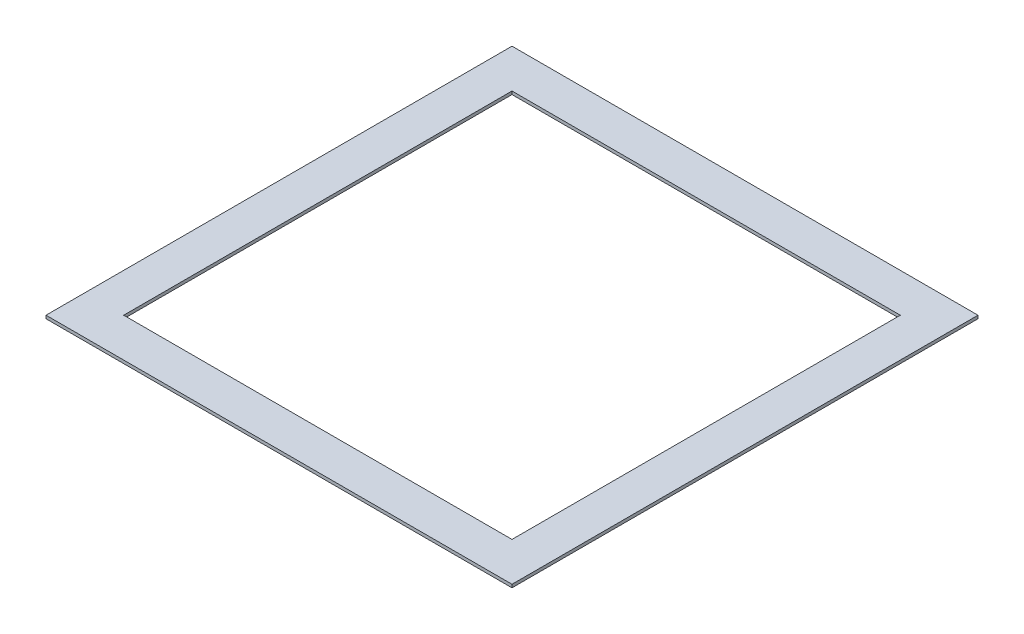
ISO-10303-21;
HEADER;
FILE_DESCRIPTION(('STEP AP214'),'2;1');
FILE_NAME('part.step','',(''),(''),'','','');
FILE_SCHEMA(('AUTOMOTIVE_DESIGN { 1 0 10303 214 1 1 1 1 }'));
ENDSEC;
DATA;
#1=APPLICATION_CONTEXT('core data for automotive mechanical design processes');
#2=APPLICATION_PROTOCOL_DEFINITION('international standard','automotive_design',2000,#1);
#3=PRODUCT_CONTEXT('',#1,'mechanical');
#4=PRODUCT('Part','Part','',(#3));
#5=PRODUCT_RELATED_PRODUCT_CATEGORY('part','',(#4));
#6=PRODUCT_DEFINITION_FORMATION('','',#4);
#7=PRODUCT_DEFINITION_CONTEXT('part definition',#1,'design');
#8=PRODUCT_DEFINITION('design','',#6,#7);
#9=PRODUCT_DEFINITION_SHAPE('','',#8);
#10=(LENGTH_UNIT() NAMED_UNIT(*) SI_UNIT(.MILLI.,.METRE.));
#11=(NAMED_UNIT(*) PLANE_ANGLE_UNIT() SI_UNIT($,.RADIAN.));
#12=(NAMED_UNIT(*) SI_UNIT($,.STERADIAN.) SOLID_ANGLE_UNIT());
#13=UNCERTAINTY_MEASURE_WITH_UNIT(LENGTH_MEASURE(1.E-05),#10,'distance_accuracy_value','');
#14=(GEOMETRIC_REPRESENTATION_CONTEXT(3) GLOBAL_UNCERTAINTY_ASSIGNED_CONTEXT((#13)) GLOBAL_UNIT_ASSIGNED_CONTEXT((#10,
#11,#12)) REPRESENTATION_CONTEXT('',''));
#15=CARTESIAN_POINT('',(0.,0.,0.));
#16=DIRECTION('',(0.,0.,1.));
#17=DIRECTION('',(1.,0.,0.));
#18=AXIS2_PLACEMENT_3D('',#15,#16,#17);
#19=CARTESIAN_POINT('',(600.,-8.,600.));
#20=DIRECTION('',(1.,0.,0.));
#21=DIRECTION('',(0.,0.,-1.));
#22=AXIS2_PLACEMENT_3D('',#19,#20,#21);
#23=PLANE('',#22);
#24=DIRECTION('',(0.,0.,-1.));
#25=VECTOR('',#24,1.);
#26=CARTESIAN_POINT('',(600.,0.,600.));
#27=LINE('',#26,#25);
#28=CARTESIAN_POINT('',(600.,0.,600.));
#29=VERTEX_POINT('',#28);
#30=CARTESIAN_POINT('',(600.,0.,-600.));
#31=VERTEX_POINT('',#30);
#32=EDGE_CURVE('E129',#29,#31,#27,.T.);
#33=ORIENTED_EDGE('',*,*,#32,.F.);
#34=DIRECTION('',(0.,1.,0.));
#35=VECTOR('',#34,1.);
#36=CARTESIAN_POINT('',(600.,-8.,600.));
#37=LINE('',#36,#35);
#38=CARTESIAN_POINT('',(600.,-8.,600.));
#39=VERTEX_POINT('',#38);
#40=EDGE_CURVE('E11',#39,#29,#37,.T.);
#41=ORIENTED_EDGE('',*,*,#40,.F.);
#42=DIRECTION('',(0.,0.,-1.));
#43=VECTOR('',#42,1.);
#44=CARTESIAN_POINT('',(600.,-8.,600.));
#45=LINE('',#44,#43);
#46=CARTESIAN_POINT('',(600.,-8.,-600.));
#47=VERTEX_POINT('',#46);
#48=EDGE_CURVE('E133',#39,#47,#45,.T.);
#49=ORIENTED_EDGE('',*,*,#48,.T.);
#50=DIRECTION('',(0.,1.,0.));
#51=VECTOR('',#50,1.);
#52=CARTESIAN_POINT('',(600.,-8.,-600.));
#53=LINE('',#52,#51);
#54=EDGE_CURVE('E34',#47,#31,#53,.T.);
#55=ORIENTED_EDGE('',*,*,#54,.T.);
#56=EDGE_LOOP('',(#33,#41,#49,#55));
#57=FACE_BOUND('',#56,.T.);
#58=ADVANCED_FACE('F31',(#57),#23,.T.);
#59=CARTESIAN_POINT('',(-599.999999999999,-8.,600.));
#60=DIRECTION('',(0.,0.,1.));
#61=DIRECTION('',(1.,0.,0.));
#62=AXIS2_PLACEMENT_3D('',#59,#60,#61);
#63=PLANE('',#62);
#64=DIRECTION('',(1.,0.,0.));
#65=VECTOR('',#64,1.);
#66=CARTESIAN_POINT('',(-599.999999999999,0.,600.));
#67=LINE('',#66,#65);
#68=CARTESIAN_POINT('',(-599.999999999999,0.,600.));
#69=VERTEX_POINT('',#68);
#70=EDGE_CURVE('E137',#69,#29,#67,.T.);
#71=ORIENTED_EDGE('',*,*,#70,.F.);
#72=DIRECTION('',(0.,1.,0.));
#73=VECTOR('',#72,1.);
#74=CARTESIAN_POINT('',(-599.999999999999,-8.,600.));
#75=LINE('',#74,#73);
#76=CARTESIAN_POINT('',(-599.999999999999,-8.,600.));
#77=VERTEX_POINT('',#76);
#78=EDGE_CURVE('E39',#77,#69,#75,.T.);
#79=ORIENTED_EDGE('',*,*,#78,.F.);
#80=DIRECTION('',(1.,0.,0.));
#81=VECTOR('',#80,1.);
#82=CARTESIAN_POINT('',(-599.999999999999,-8.,600.));
#83=LINE('',#82,#81);
#84=EDGE_CURVE('E143',#77,#39,#83,.T.);
#85=ORIENTED_EDGE('',*,*,#84,.T.);
#86=ORIENTED_EDGE('',*,*,#40,.T.);
#87=EDGE_LOOP('',(#71,#79,#85,#86));
#88=FACE_BOUND('',#87,.T.);
#89=ADVANCED_FACE('F169',(#88),#63,.T.);
#90=CARTESIAN_POINT('',(-599.999999999999,-8.,600.));
#91=DIRECTION('',(-1.,0.,0.));
#92=DIRECTION('',(0.,0.,1.));
#93=AXIS2_PLACEMENT_3D('',#90,#91,#92);
#94=PLANE('',#93);
#95=DIRECTION('',(0.,0.,1.));
#96=VECTOR('',#95,1.);
#97=CARTESIAN_POINT('',(-599.999999999999,0.,600.));
#98=LINE('',#97,#96);
#99=CARTESIAN_POINT('',(-599.999999999999,0.,-600.));
#100=VERTEX_POINT('',#99);
#101=EDGE_CURVE('E151',#100,#69,#98,.T.);
#102=ORIENTED_EDGE('',*,*,#101,.F.);
#103=DIRECTION('',(0.,1.,0.));
#104=VECTOR('',#103,1.);
#105=CARTESIAN_POINT('',(-599.999999999999,-8.,-600.));
#106=LINE('',#105,#104);
#107=CARTESIAN_POINT('',(-599.999999999999,-8.,-600.));
#108=VERTEX_POINT('',#107);
#109=EDGE_CURVE('E156',#108,#100,#106,.T.);
#110=ORIENTED_EDGE('',*,*,#109,.F.);
#111=DIRECTION('',(0.,0.,1.));
#112=VECTOR('',#111,1.);
#113=CARTESIAN_POINT('',(-599.999999999999,-8.,600.));
#114=LINE('',#113,#112);
#115=EDGE_CURVE('E140',#108,#77,#114,.T.);
#116=ORIENTED_EDGE('',*,*,#115,.T.);
#117=ORIENTED_EDGE('',*,*,#78,.T.);
#118=EDGE_LOOP('',(#102,#110,#116,#117));
#119=FACE_BOUND('',#118,.T.);
#120=ADVANCED_FACE('F173',(#119),#94,.T.);
#121=CARTESIAN_POINT('',(-599.999999999999,-8.,-600.));
#122=DIRECTION('',(0.,0.,-1.));
#123=DIRECTION('',(-1.,0.,0.));
#124=AXIS2_PLACEMENT_3D('',#121,#122,#123);
#125=PLANE('',#124);
#126=DIRECTION('',(-1.,0.,0.));
#127=VECTOR('',#126,1.);
#128=CARTESIAN_POINT('',(-599.999999999999,0.,-600.));
#129=LINE('',#128,#127);
#130=EDGE_CURVE('E148',#31,#100,#129,.T.);
#131=ORIENTED_EDGE('',*,*,#130,.F.);
#132=ORIENTED_EDGE('',*,*,#54,.F.);
#133=DIRECTION('',(-1.,0.,0.));
#134=VECTOR('',#133,1.);
#135=CARTESIAN_POINT('',(-599.999999999999,-8.,-600.));
#136=LINE('',#135,#134);
#137=EDGE_CURVE('E136',#47,#108,#136,.T.);
#138=ORIENTED_EDGE('',*,*,#137,.T.);
#139=ORIENTED_EDGE('',*,*,#109,.T.);
#140=EDGE_LOOP('',(#131,#132,#138,#139));
#141=FACE_BOUND('',#140,.T.);
#142=ADVANCED_FACE('F164',(#141),#125,.T.);
#143=CARTESIAN_POINT('',(600.,-8.,-600.));
#144=DIRECTION('',(0.,-1.,0.));
#145=DIRECTION('',(0.,0.,-1.));
#146=AXIS2_PLACEMENT_3D('',#143,#144,#145);
#147=PLANE('',#146);
#148=DIRECTION('',(0.,0.,1.));
#149=VECTOR('',#148,1.);
#150=CARTESIAN_POINT('',(-500.,-8.,-500.));
#151=LINE('',#150,#149);
#152=CARTESIAN_POINT('',(-500.,-8.,-500.));
#153=VERTEX_POINT('',#152);
#154=CARTESIAN_POINT('',(-500.,-8.,500.));
#155=VERTEX_POINT('',#154);
#156=EDGE_CURVE('E98',#153,#155,#151,.T.);
#157=ORIENTED_EDGE('',*,*,#156,.T.);
#158=DIRECTION('',(1.,0.,0.));
#159=VECTOR('',#158,1.);
#160=CARTESIAN_POINT('',(500.,-8.,500.000000000001));
#161=LINE('',#160,#159);
#162=CARTESIAN_POINT('',(500.,-8.,500.));
#163=VERTEX_POINT('',#162);
#164=EDGE_CURVE('E107',#155,#163,#161,.T.);
#165=ORIENTED_EDGE('',*,*,#164,.T.);
#166=DIRECTION('',(0.,0.,-1.));
#167=VECTOR('',#166,1.);
#168=CARTESIAN_POINT('',(500.000000000001,-8.,-500.));
#169=LINE('',#168,#167);
#170=CARTESIAN_POINT('',(500.000000000001,-8.,-500.));
#171=VERTEX_POINT('',#170);
#172=EDGE_CURVE('E47',#163,#171,#169,.T.);
#173=ORIENTED_EDGE('',*,*,#172,.T.);
#174=DIRECTION('',(-1.,0.,0.));
#175=VECTOR('',#174,1.);
#176=CARTESIAN_POINT('',(500.000000000001,-8.,-500.));
#177=LINE('',#176,#175);
#178=EDGE_CURVE('E104',#171,#153,#177,.T.);
#179=ORIENTED_EDGE('',*,*,#178,.T.);
#180=EDGE_LOOP('',(#157,#165,#173,#179));
#181=FACE_BOUND('',#180,.T.);
#182=ORIENTED_EDGE('',*,*,#48,.F.);
#183=ORIENTED_EDGE('',*,*,#84,.F.);
#184=ORIENTED_EDGE('',*,*,#115,.F.);
#185=ORIENTED_EDGE('',*,*,#137,.F.);
#186=EDGE_LOOP('',(#182,#183,#184,#185));
#187=FACE_BOUND('',#186,.T.);
#188=ADVANCED_FACE('F111',(#181,#187),#147,.T.);
#189=CARTESIAN_POINT('',(600.,0.,-600.));
#190=DIRECTION('',(0.,-1.,0.));
#191=DIRECTION('',(0.,0.,-1.));
#192=AXIS2_PLACEMENT_3D('',#189,#190,#191);
#193=PLANE('',#192);
#194=DIRECTION('',(1.,0.,0.));
#195=VECTOR('',#194,1.);
#196=CARTESIAN_POINT('',(500.,0.,500.000000000001));
#197=LINE('',#196,#195);
#198=CARTESIAN_POINT('',(-500.,0.,500.));
#199=VERTEX_POINT('',#198);
#200=CARTESIAN_POINT('',(500.,0.,500.000000000001));
#201=VERTEX_POINT('',#200);
#202=EDGE_CURVE('E123',#199,#201,#197,.T.);
#203=ORIENTED_EDGE('',*,*,#202,.F.);
#204=DIRECTION('',(0.,0.,1.));
#205=VECTOR('',#204,1.);
#206=CARTESIAN_POINT('',(-500.,0.,-500.));
#207=LINE('',#206,#205);
#208=CARTESIAN_POINT('',(-500.,0.,-500.));
#209=VERTEX_POINT('',#208);
#210=EDGE_CURVE('E55',#209,#199,#207,.T.);
#211=ORIENTED_EDGE('',*,*,#210,.F.);
#212=DIRECTION('',(-1.,0.,0.));
#213=VECTOR('',#212,1.);
#214=CARTESIAN_POINT('',(500.000000000001,0.,-500.));
#215=LINE('',#214,#213);
#216=CARTESIAN_POINT('',(500.000000000001,0.,-500.));
#217=VERTEX_POINT('',#216);
#218=EDGE_CURVE('E114',#217,#209,#215,.T.);
#219=ORIENTED_EDGE('',*,*,#218,.F.);
#220=DIRECTION('',(0.,0.,-1.));
#221=VECTOR('',#220,1.);
#222=CARTESIAN_POINT('',(500.000000000001,0.,-500.));
#223=LINE('',#222,#221);
#224=EDGE_CURVE('E117',#201,#217,#223,.T.);
#225=ORIENTED_EDGE('',*,*,#224,.F.);
#226=EDGE_LOOP('',(#203,#211,#219,#225));
#227=FACE_BOUND('',#226,.T.);
#228=ORIENTED_EDGE('',*,*,#32,.T.);
#229=ORIENTED_EDGE('',*,*,#130,.T.);
#230=ORIENTED_EDGE('',*,*,#101,.T.);
#231=ORIENTED_EDGE('',*,*,#70,.T.);
#232=EDGE_LOOP('',(#228,#229,#230,#231));
#233=FACE_BOUND('',#232,.T.);
#234=ADVANCED_FACE('F166',(#227,#233),#193,.F.);
#235=CARTESIAN_POINT('',(-500.,-8.,-500.));
#236=DIRECTION('',(-1.,0.,0.));
#237=DIRECTION('',(0.,0.,1.));
#238=AXIS2_PLACEMENT_3D('',#235,#236,#237);
#239=PLANE('',#238);
#240=ORIENTED_EDGE('',*,*,#210,.T.);
#241=DIRECTION('',(0.,1.,0.));
#242=VECTOR('',#241,1.);
#243=CARTESIAN_POINT('',(-500.,-8.,500.));
#244=LINE('',#243,#242);
#245=EDGE_CURVE('E94',#155,#199,#244,.T.);
#246=ORIENTED_EDGE('',*,*,#245,.F.);
#247=ORIENTED_EDGE('',*,*,#156,.F.);
#248=DIRECTION('',(0.,1.,0.));
#249=VECTOR('',#248,1.);
#250=CARTESIAN_POINT('',(-500.,-8.,-500.));
#251=LINE('',#250,#249);
#252=EDGE_CURVE('E127',#153,#209,#251,.T.);
#253=ORIENTED_EDGE('',*,*,#252,.T.);
#254=EDGE_LOOP('',(#240,#246,#247,#253));
#255=FACE_BOUND('',#254,.T.);
#256=ADVANCED_FACE('F96',(#255),#239,.F.);
#257=CARTESIAN_POINT('',(500.000000000001,-8.,-500.));
#258=DIRECTION('',(0.,0.,-1.));
#259=DIRECTION('',(-1.,0.,0.));
#260=AXIS2_PLACEMENT_3D('',#257,#258,#259);
#261=PLANE('',#260);
#262=ORIENTED_EDGE('',*,*,#218,.T.);
#263=ORIENTED_EDGE('',*,*,#252,.F.);
#264=ORIENTED_EDGE('',*,*,#178,.F.);
#265=DIRECTION('',(0.,1.,0.));
#266=VECTOR('',#265,1.);
#267=CARTESIAN_POINT('',(500.000000000001,-8.,-500.));
#268=LINE('',#267,#266);
#269=EDGE_CURVE('E130',#171,#217,#268,.T.);
#270=ORIENTED_EDGE('',*,*,#269,.T.);
#271=EDGE_LOOP('',(#262,#263,#264,#270));
#272=FACE_BOUND('',#271,.T.);
#273=ADVANCED_FACE('F224',(#272),#261,.F.);
#274=CARTESIAN_POINT('',(500.000000000001,-8.,-500.));
#275=DIRECTION('',(1.,0.,0.));
#276=DIRECTION('',(0.,0.,-1.));
#277=AXIS2_PLACEMENT_3D('',#274,#275,#276);
#278=PLANE('',#277);
#279=ORIENTED_EDGE('',*,*,#224,.T.);
#280=ORIENTED_EDGE('',*,*,#269,.F.);
#281=ORIENTED_EDGE('',*,*,#172,.F.);
#282=DIRECTION('',(0.,1.,0.));
#283=VECTOR('',#282,1.);
#284=CARTESIAN_POINT('',(500.,-8.,500.000000000001));
#285=LINE('',#284,#283);
#286=EDGE_CURVE('E103',#163,#201,#285,.T.);
#287=ORIENTED_EDGE('',*,*,#286,.T.);
#288=EDGE_LOOP('',(#279,#280,#281,#287));
#289=FACE_BOUND('',#288,.T.);
#290=ADVANCED_FACE('F233',(#289),#278,.F.);
#291=CARTESIAN_POINT('',(500.,-8.,500.000000000001));
#292=DIRECTION('',(0.,0.,1.));
#293=DIRECTION('',(1.,0.,0.));
#294=AXIS2_PLACEMENT_3D('',#291,#292,#293);
#295=PLANE('',#294);
#296=ORIENTED_EDGE('',*,*,#202,.T.);
#297=ORIENTED_EDGE('',*,*,#286,.F.);
#298=ORIENTED_EDGE('',*,*,#164,.F.);
#299=ORIENTED_EDGE('',*,*,#245,.T.);
#300=EDGE_LOOP('',(#296,#297,#298,#299));
#301=FACE_BOUND('',#300,.T.);
#302=ADVANCED_FACE('F108',(#301),#295,.F.);
#303=CLOSED_SHELL('',(#58,#89,#120,#142,#188,#234,#256,#273,#290,#302));
#304=MANIFOLD_SOLID_BREP('B2',#303);
#305=ADVANCED_BREP_SHAPE_REPRESENTATION('',(#18,#304),#14);
#306=SHAPE_DEFINITION_REPRESENTATION(#9,#305);
ENDSEC;
END-ISO-10303-21;
